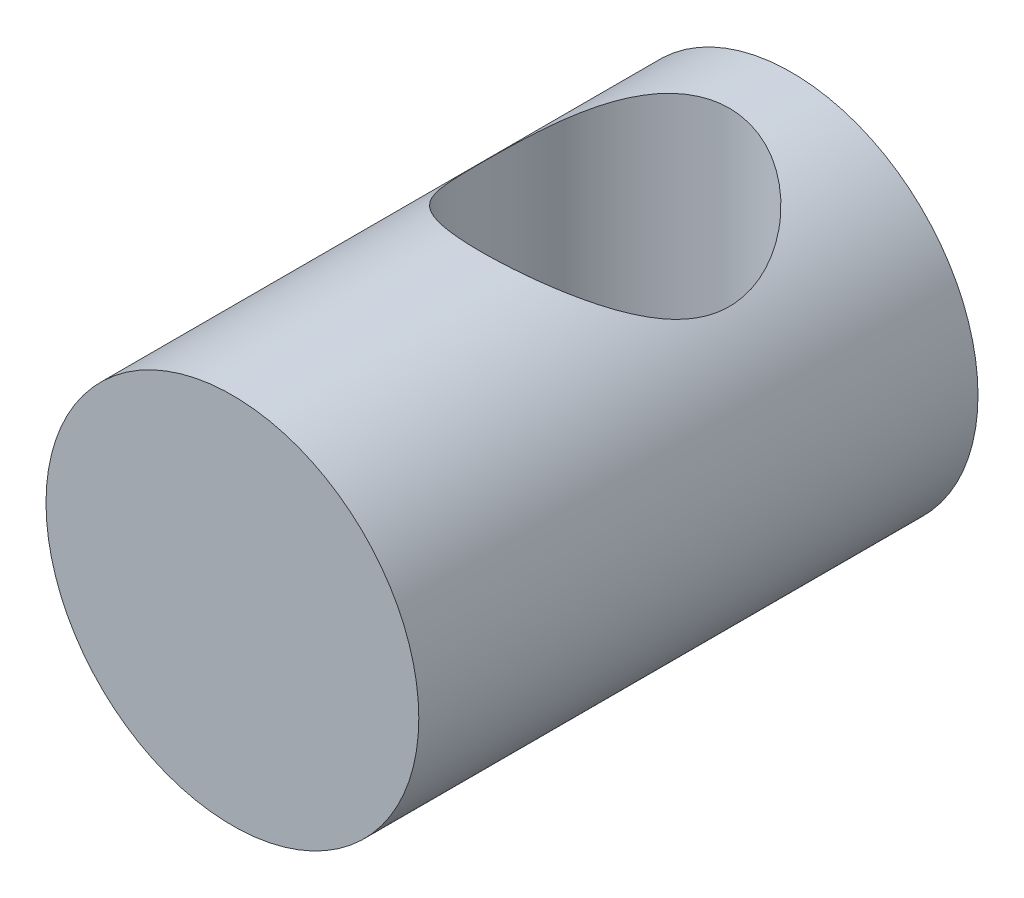
ISO-10303-21;
HEADER;
FILE_DESCRIPTION(('STEP AP214'),'2;1');
FILE_NAME('part.step','',(''),(''),'','','');
FILE_SCHEMA(('AUTOMOTIVE_DESIGN { 1 0 10303 214 1 1 1 1 }'));
ENDSEC;
DATA;
#1=APPLICATION_CONTEXT('core data for automotive mechanical design processes');
#2=APPLICATION_PROTOCOL_DEFINITION('international standard','automotive_design',2000,#1);
#3=PRODUCT_CONTEXT('',#1,'mechanical');
#4=PRODUCT('Part','Part','',(#3));
#5=PRODUCT_RELATED_PRODUCT_CATEGORY('part','',(#4));
#6=PRODUCT_DEFINITION_FORMATION('','',#4);
#7=PRODUCT_DEFINITION_CONTEXT('part definition',#1,'design');
#8=PRODUCT_DEFINITION('design','',#6,#7);
#9=PRODUCT_DEFINITION_SHAPE('','',#8);
#10=(LENGTH_UNIT() NAMED_UNIT(*) SI_UNIT(.MILLI.,.METRE.));
#11=(NAMED_UNIT(*) PLANE_ANGLE_UNIT() SI_UNIT($,.RADIAN.));
#12=(NAMED_UNIT(*) SI_UNIT($,.STERADIAN.) SOLID_ANGLE_UNIT());
#13=UNCERTAINTY_MEASURE_WITH_UNIT(LENGTH_MEASURE(1.E-05),#10,'distance_accuracy_value','');
#14=(GEOMETRIC_REPRESENTATION_CONTEXT(3) GLOBAL_UNCERTAINTY_ASSIGNED_CONTEXT((#13)) GLOBAL_UNIT_ASSIGNED_CONTEXT((#10,
#11,#12)) REPRESENTATION_CONTEXT('',''));
#15=CARTESIAN_POINT('',(0.,0.,0.));
#16=DIRECTION('',(0.,0.,1.));
#17=DIRECTION('',(1.,0.,0.));
#18=AXIS2_PLACEMENT_3D('',#15,#16,#17);
#19=CARTESIAN_POINT('',(0.,0.,-14.2875));
#20=DIRECTION('',(0.,0.,1.));
#21=DIRECTION('',(1.,0.,0.));
#22=AXIS2_PLACEMENT_3D('',#19,#20,#21);
#23=CYLINDRICAL_SURFACE('',#22,4.7625);
#24=CARTESIAN_POINT('',(0.,-4.7625,-12.7));
#25=CARTESIAN_POINT('',(-0.159513506146524,-4.76249829558772,-12.6999978538767));
#26=CARTESIAN_POINT('',(-0.319036822940595,-4.75441585981929,-12.6879120137824));
#27=CARTESIAN_POINT('',(-0.632990333269337,-4.72288699141972,-12.6403157875296));
#28=CARTESIAN_POINT('',(-0.787418072256467,-4.6994332647002,-12.6047942804673));
#29=CARTESIAN_POINT('',(-1.0861866118583,-4.63947623936465,-12.5125037833269));
#30=CARTESIAN_POINT('',(-1.23057094564588,-4.60303407934685,-12.4558342823537));
#31=CARTESIAN_POINT('',(-1.50719688917279,-4.52002748417047,-12.3236619686986));
#32=CARTESIAN_POINT('',(-1.63943673208792,-4.47346157948094,-12.2481564216004));
#33=CARTESIAN_POINT('',(-1.90068942785739,-4.36923384005694,-12.0734820944603));
#34=CARTESIAN_POINT('',(-2.0284762255929,-4.31096574538352,-11.9728490163642));
#35=CARTESIAN_POINT('',(-2.26651828028912,-4.19071922389352,-11.754278552468));
#36=CARTESIAN_POINT('',(-2.37674794067855,-4.12873555797057,-11.6363163752297));
#37=CARTESIAN_POINT('',(-2.59432897361932,-3.99618620055343,-11.3648293648552));
#38=CARTESIAN_POINT('',(-2.69848308269039,-3.92580920318787,-11.2086300251264));
#39=CARTESIAN_POINT('',(-2.87893691841686,-3.79546083955008,-10.8769731383985));
#40=CARTESIAN_POINT('',(-2.95528481583057,-3.73547157335729,-10.7015495876129));
#41=CARTESIAN_POINT('',(-3.0587003056751,-3.65087323287846,-10.3874708216265));
#42=CARTESIAN_POINT('',(-3.09363184983488,-3.62104984276855,-10.2528235810431));
#43=CARTESIAN_POINT('',(-3.14564105737718,-3.57597026836952,-9.97784309874219));
#44=CARTESIAN_POINT('',(-3.16274949511548,-3.56068897885195,-9.83752009390908));
#45=CARTESIAN_POINT('',(-3.17803790572636,-3.54705611398895,-9.55440878855361));
#46=CARTESIAN_POINT('',(-3.17614050629003,-3.54877374048434,-9.41161277524195));
#47=CARTESIAN_POINT('',(-3.1533716036927,-3.56901393593137,-9.12870447959653));
#48=CARTESIAN_POINT('',(-3.13248402562585,-3.58755074204361,-8.9885945736282));
#49=CARTESIAN_POINT('',(-3.07443178311274,-3.63739407712628,-8.7209835560414));
#50=CARTESIAN_POINT('',(-3.03802591942409,-3.66810112544892,-8.59319887882005));
#51=CARTESIAN_POINT('',(-2.95068813219861,-3.73871526235139,-8.34544989020324));
#52=CARTESIAN_POINT('',(-2.89975142875274,-3.77862537744388,-8.22548816814286));
#53=CARTESIAN_POINT('',(-2.77294687249444,-3.87293161809884,-7.97079718501153));
#54=CARTESIAN_POINT('',(-2.69411533030023,-3.92862304429405,-7.83802740802083));
#55=CARTESIAN_POINT('',(-2.51886974692605,-4.04322816135652,-7.58605385994608));
#56=CARTESIAN_POINT('',(-2.42243402035992,-4.10214576296336,-7.46686711829168));
#57=CARTESIAN_POINT('',(-2.19045099950254,-4.23137558230652,-7.21908870886798));
#58=CARTESIAN_POINT('',(-2.05095377025594,-4.30140657245416,-7.09400719771968));
#59=CARTESIAN_POINT('',(-1.74943769853673,-4.43258734804498,-6.8688005649166));
#60=CARTESIAN_POINT('',(-1.58744015020742,-4.493745420159,-6.76865209416239));
#61=CARTESIAN_POINT('',(-1.2777118005163,-4.59018328993748,-6.61435412168688));
#62=CARTESIAN_POINT('',(-1.13340775885306,-4.62818577100373,-6.55503616069962));
#63=CARTESIAN_POINT('',(-0.835082219747427,-4.69118503960837,-6.45778343056955));
#64=CARTESIAN_POINT('',(-0.681069057915084,-4.71619281752454,-6.41983058942756));
#65=CARTESIAN_POINT('',(-0.366689406911034,-4.75100462923954,-6.36720665018473));
#66=CARTESIAN_POINT('',(-0.206298501445474,-4.76074299407139,-6.35263610576051));
#67=CARTESIAN_POINT('',(0.115000912030583,-4.76381945007165,-6.34802024690749));
#68=CARTESIAN_POINT('',(0.275909383071218,-4.75715868774695,-6.35797321797411));
#69=CARTESIAN_POINT('',(0.581748451061771,-4.72915598211033,-6.40020318820457));
#70=CARTESIAN_POINT('',(0.727007443428386,-4.70887816144478,-6.43086296018629));
#71=CARTESIAN_POINT('',(1.00983477297833,-4.65643038239684,-6.51128315154554));
#72=CARTESIAN_POINT('',(1.14740187964354,-4.62425852748368,-6.561046617099));
#73=CARTESIAN_POINT('',(1.42028029136544,-4.54812959640013,-6.68123552155831));
#74=CARTESIAN_POINT('',(1.55495019310494,-4.50357668840463,-6.75272994460303));
#75=CARTESIAN_POINT('',(1.81083430052963,-4.40692945783369,-6.91266284779163));
#76=CARTESIAN_POINT('',(1.93204012275933,-4.35483048266614,-7.00111179235199));
#77=CARTESIAN_POINT('',(2.17781894704302,-4.23790342811906,-7.20821499069174));
#78=CARTESIAN_POINT('',(2.29989360271145,-4.17236523918599,-7.32943393783591));
#79=CARTESIAN_POINT('',(2.52307674305786,-4.04131737275621,-7.59001439509023));
#80=CARTESIAN_POINT('',(2.62417073664107,-3.97580774594569,-7.72938833720815));
#81=CARTESIAN_POINT('',(2.79598082787364,-3.85666740360083,-8.01233858015499));
#82=CARTESIAN_POINT('',(2.86854322403869,-3.80250060257811,-8.15456210271089));
#83=CARTESIAN_POINT('',(2.99237739257787,-3.70584371667973,-8.45164783616389));
#84=CARTESIAN_POINT('',(3.04368748566418,-3.66333266217137,-8.6064866910816));
#85=CARTESIAN_POINT('',(3.11524401668582,-3.60256467927561,-8.89724612217364));
#86=CARTESIAN_POINT('',(3.13941774208685,-3.58132059145467,-9.03156024390672));
#87=CARTESIAN_POINT('',(3.17022488831674,-3.55408653184003,-9.30366008835974));
#88=CARTESIAN_POINT('',(3.17687736084457,-3.54807999179148,-9.44144187574552));
#89=CARTESIAN_POINT('',(3.17220478264998,-3.55225668535638,-9.71652083672794));
#90=CARTESIAN_POINT('',(3.16086908702961,-3.56244950530632,-9.85381767515023));
#91=CARTESIAN_POINT('',(3.12097725174618,-3.59744096141944,-10.1240329106542));
#92=CARTESIAN_POINT('',(3.09239813794198,-3.6222590824651,-10.2569452164285));
#93=CARTESIAN_POINT('',(3.00978981561158,-3.69136350740653,-10.5500662289897));
#94=CARTESIAN_POINT('',(2.9510082914772,-3.7390752101256,-10.7081113219288));
#95=CARTESIAN_POINT('',(2.8112152810101,-3.84527739400296,-11.0100865236058));
#96=CARTESIAN_POINT('',(2.73017258412971,-3.90378297026142,-11.1539964271167));
#97=CARTESIAN_POINT('',(2.54632873237354,-4.02617059026332,-11.4288554963364));
#98=CARTESIAN_POINT('',(2.44315837250286,-4.09013111420676,-11.559521063736));
#99=CARTESIAN_POINT('',(2.21726660759134,-4.21685775015533,-11.8035913840574));
#100=CARTESIAN_POINT('',(2.09453921249742,-4.27962348959933,-11.9169908277243));
#101=CARTESIAN_POINT('',(1.88738506601081,-4.37333498138707,-12.0799185849831));
#102=CARTESIAN_POINT('',(1.80901344364311,-4.40641312548886,-12.1360276198673));
#103=CARTESIAN_POINT('',(1.64665981934885,-4.46961905722943,-12.2413377988571));
#104=CARTESIAN_POINT('',(1.56268042207705,-4.49974819878214,-12.2905421175234));
#105=CARTESIAN_POINT('',(1.38960715113394,-4.55616827072524,-12.3814235622438));
#106=CARTESIAN_POINT('',(1.30051812806184,-4.58246276002165,-12.4231076763622));
#107=CARTESIAN_POINT('',(1.11782960098097,-4.63042056995049,-12.4983567282061));
#108=CARTESIAN_POINT('',(1.02423169482463,-4.65208551661339,-12.5319245171684));
#109=CARTESIAN_POINT('',(0.780235392827383,-4.70058109652366,-12.6065413998412));
#110=CARTESIAN_POINT('',(0.627104096318102,-4.72362103868264,-12.6414276568918));
#111=CARTESIAN_POINT('',(0.315982580686498,-4.75457565287333,-12.6881493609694));
#112=CARTESIAN_POINT('',(0.157996102785212,-4.76250168819873,-12.7000021257078));
#113=CARTESIAN_POINT('',(0.,-4.7625,-12.7));
#114=B_SPLINE_CURVE_WITH_KNOTS('',3,(#24,#25,#26,#27,#28,#29,#30,#31,#32,#33,#34,#35,#36,#37,
#38,#39,#40,#41,#42,#43,#44,#45,#46,#47,#48,#49,#50,#51,#52,#53,#54,#55,#56,#57,#58,#59,#60,#61,
#62,#63,#64,#65,#66,#67,#68,#69,#70,#71,#72,#73,#74,#75,#76,#77,#78,#79,#80,#81,#82,#83,#84,#85,
#86,#87,#88,#89,#90,#91,#92,#93,#94,#95,#96,#97,#98,#99,#100,#101,#102,#103,#104,#105,#106,#107,
#108,#109,#110,#111,#112,#113),.UNSPECIFIED.,.T.,.F.,(4,2,2,2,2,2,2,2,2,2,2,2,2,2,2,2,2,2,2,2,2,
2,2,2,2,2,2,2,2,2,2,2,2,2,2,2,2,2,2,2,2,2,2,2,4),(0.,0.477921997077322,0.956070945278542,
1.43199826818949,1.90799472139476,2.42438283538384,2.94151703421856,3.54023109732372,
4.13790297394634,4.56300988710696,4.98738156455222,5.41348154879912,5.83994255655571,
6.24758818745149,6.6553680680092,7.14609274784494,7.63742604761198,8.23466340273952,
8.8313393398877,9.31106989228961,9.79039404549573,10.2717740223998,10.7531203456965,
11.2006552211841,11.6482614879236,12.1229810060221,12.5979944723587,13.1481222963466,
13.6986288317687,14.2025677230621,14.705593948025,15.1181442623597,15.5302458053914,
15.9425913096208,16.3554874162604,16.8784049132826,17.4020593249786,17.9352455177247,
18.4685953331297,18.7739424593009,19.0791487337135,19.3840699212457,19.6888838348844,
20.1626158186784,20.635991489477),.UNSPECIFIED.);
#115=CARTESIAN_POINT('',(0.,-4.7625,-12.7));
#116=VERTEX_POINT('',#115);
#117=EDGE_CURVE('E50',#116,#116,#114,.T.);
#118=ORIENTED_EDGE('',*,*,#117,.T.);
#119=EDGE_LOOP('',(#118));
#120=FACE_BOUND('',#119,.T.);
#121=CARTESIAN_POINT('',(0.,0.,-14.2875));
#122=DIRECTION('',(0.,0.,1.));
#123=DIRECTION('',(1.,0.,0.));
#124=AXIS2_PLACEMENT_3D('',#121,#122,#123);
#125=CIRCLE('',#124,4.7625);
#126=CARTESIAN_POINT('',(4.7625,0.,-14.2875));
#127=VERTEX_POINT('',#126);
#128=EDGE_CURVE('E10',#127,#127,#125,.T.);
#129=ORIENTED_EDGE('',*,*,#128,.T.);
#130=EDGE_LOOP('',(#129));
#131=FACE_BOUND('',#130,.T.);
#132=CARTESIAN_POINT('',(0.,0.,0.));
#133=DIRECTION('',(0.,0.,1.));
#134=DIRECTION('',(1.,0.,0.));
#135=AXIS2_PLACEMENT_3D('',#132,#133,#134);
#136=CIRCLE('',#135,4.7625);
#137=CARTESIAN_POINT('',(4.7625,0.,0.));
#138=VERTEX_POINT('',#137);
#139=EDGE_CURVE('E44',#138,#138,#136,.T.);
#140=ORIENTED_EDGE('',*,*,#139,.F.);
#141=EDGE_LOOP('',(#140));
#142=FACE_BOUND('',#141,.T.);
#143=CARTESIAN_POINT('',(0.,4.7625,-12.7));
#144=CARTESIAN_POINT('',(0.159513506146528,4.76249829558772,-12.6999978538767));
#145=CARTESIAN_POINT('',(0.319036822940599,4.75441585981929,-12.6879120137824));
#146=CARTESIAN_POINT('',(0.63299033326934,4.72288699141972,-12.6403157875296));
#147=CARTESIAN_POINT('',(0.78741807225647,4.6994332647002,-12.6047942804673));
#148=CARTESIAN_POINT('',(1.08618661185831,4.63947623936465,-12.5125037833269));
#149=CARTESIAN_POINT('',(1.23057094564588,4.60303407934685,-12.4558342823537));
#150=CARTESIAN_POINT('',(1.50719688917279,4.52002748417047,-12.3236619686986));
#151=CARTESIAN_POINT('',(1.63943673208792,4.47346157948094,-12.2481564216004));
#152=CARTESIAN_POINT('',(1.9006894278574,4.36923384005694,-12.0734820944603));
#153=CARTESIAN_POINT('',(2.0284762255929,4.31096574538352,-11.9728490163642));
#154=CARTESIAN_POINT('',(2.26651828028912,4.19071922389352,-11.754278552468));
#155=CARTESIAN_POINT('',(2.37674794067855,4.12873555797056,-11.6363163752297));
#156=CARTESIAN_POINT('',(2.59432897361933,3.99618620055343,-11.3648293648552));
#157=CARTESIAN_POINT('',(2.69848308269039,3.92580920318787,-11.2086300251264));
#158=CARTESIAN_POINT('',(2.87893691841686,3.79546083955007,-10.8769731383985));
#159=CARTESIAN_POINT('',(2.95528481583058,3.73547157335728,-10.7015495876129));
#160=CARTESIAN_POINT('',(3.0587003056751,3.65087323287846,-10.3874708216265));
#161=CARTESIAN_POINT('',(3.09363184983489,3.62104984276855,-10.2528235810431));
#162=CARTESIAN_POINT('',(3.14564105737718,3.57597026836952,-9.97784309874219));
#163=CARTESIAN_POINT('',(3.16274949511548,3.56068897885195,-9.83752009390908));
#164=CARTESIAN_POINT('',(3.17803790572636,3.54705611398895,-9.55440878855361));
#165=CARTESIAN_POINT('',(3.17614050629003,3.54877374048434,-9.41161277524195));
#166=CARTESIAN_POINT('',(3.1533716036927,3.56901393593137,-9.12870447959654));
#167=CARTESIAN_POINT('',(3.13248402562585,3.58755074204361,-8.9885945736282));
#168=CARTESIAN_POINT('',(3.07443178311275,3.63739407712628,-8.72098355604141));
#169=CARTESIAN_POINT('',(3.03802591942409,3.66810112544891,-8.59319887882005));
#170=CARTESIAN_POINT('',(2.95068813219861,3.73871526235138,-8.34544989020324));
#171=CARTESIAN_POINT('',(2.89975142875275,3.77862537744388,-8.22548816814286));
#172=CARTESIAN_POINT('',(2.77294687249445,3.87293161809884,-7.97079718501153));
#173=CARTESIAN_POINT('',(2.69411533030023,3.92862304429405,-7.83802740802084));
#174=CARTESIAN_POINT('',(2.51886974692605,4.04322816135651,-7.58605385994609));
#175=CARTESIAN_POINT('',(2.42243402035992,4.10214576296336,-7.46686711829169));
#176=CARTESIAN_POINT('',(2.19045099950255,4.23137558230652,-7.21908870886799));
#177=CARTESIAN_POINT('',(2.05095377025594,4.30140657245415,-7.09400719771968));
#178=CARTESIAN_POINT('',(1.74943769853674,4.43258734804498,-6.8688005649166));
#179=CARTESIAN_POINT('',(1.58744015020743,4.493745420159,-6.76865209416239));
#180=CARTESIAN_POINT('',(1.27771180051631,4.59018328993748,-6.61435412168689));
#181=CARTESIAN_POINT('',(1.13340775885306,4.62818577100373,-6.55503616069962));
#182=CARTESIAN_POINT('',(0.835082219747434,4.69118503960837,-6.45778343056955));
#183=CARTESIAN_POINT('',(0.68106905791509,4.71619281752454,-6.41983058942756));
#184=CARTESIAN_POINT('',(0.36668940691104,4.75100462923954,-6.36720665018473));
#185=CARTESIAN_POINT('',(0.206298501445481,4.76074299407139,-6.35263610576051));
#186=CARTESIAN_POINT('',(-0.115000912030577,4.76381945007165,-6.3480202469075));
#187=CARTESIAN_POINT('',(-0.275909383071212,4.75715868774695,-6.35797321797411));
#188=CARTESIAN_POINT('',(-0.581748451061767,4.72915598211033,-6.40020318820457));
#189=CARTESIAN_POINT('',(-0.727007443428381,4.70887816144478,-6.43086296018629));
#190=CARTESIAN_POINT('',(-1.00983477297832,4.65643038239684,-6.51128315154554));
#191=CARTESIAN_POINT('',(-1.14740187964354,4.62425852748368,-6.561046617099));
#192=CARTESIAN_POINT('',(-1.42028029136543,4.54812959640013,-6.68123552155831));
#193=CARTESIAN_POINT('',(-1.55495019310494,4.50357668840464,-6.75272994460303));
#194=CARTESIAN_POINT('',(-1.81083430052962,4.40692945783369,-6.91266284779163));
#195=CARTESIAN_POINT('',(-1.93204012275932,4.35483048266614,-7.00111179235199));
#196=CARTESIAN_POINT('',(-2.17781894704302,4.23790342811906,-7.20821499069173));
#197=CARTESIAN_POINT('',(-2.29989360271144,4.172365239186,-7.32943393783591));
#198=CARTESIAN_POINT('',(-2.52307674305786,4.04131737275621,-7.59001439509023));
#199=CARTESIAN_POINT('',(-2.62417073664106,3.9758077459457,-7.72938833720815));
#200=CARTESIAN_POINT('',(-2.79598082787363,3.85666740360083,-8.01233858015499));
#201=CARTESIAN_POINT('',(-2.86854322403869,3.80250060257811,-8.15456210271089));
#202=CARTESIAN_POINT('',(-2.99237739257786,3.70584371667973,-8.45164783616389));
#203=CARTESIAN_POINT('',(-3.04368748566418,3.66333266217138,-8.6064866910816));
#204=CARTESIAN_POINT('',(-3.11524401668582,3.60256467927562,-8.89724612217364));
#205=CARTESIAN_POINT('',(-3.13941774208684,3.58132059145467,-9.03156024390672));
#206=CARTESIAN_POINT('',(-3.17022488831674,3.55408653184003,-9.30366008835974));
#207=CARTESIAN_POINT('',(-3.17687736084456,3.54807999179148,-9.44144187574552));
#208=CARTESIAN_POINT('',(-3.17220478264998,3.55225668535638,-9.71652083672794));
#209=CARTESIAN_POINT('',(-3.16086908702961,3.56244950530632,-9.85381767515024));
#210=CARTESIAN_POINT('',(-3.12097725174618,3.59744096141944,-10.1240329106542));
#211=CARTESIAN_POINT('',(-3.09239813794198,3.6222590824651,-10.2569452164285));
#212=CARTESIAN_POINT('',(-3.00978981561158,3.69136350740653,-10.5500662289897));
#213=CARTESIAN_POINT('',(-2.9510082914772,3.7390752101256,-10.7081113219288));
#214=CARTESIAN_POINT('',(-2.81121528101009,3.84527739400297,-11.0100865236058));
#215=CARTESIAN_POINT('',(-2.7301725841297,3.90378297026142,-11.1539964271167));
#216=CARTESIAN_POINT('',(-2.54632873237354,4.02617059026332,-11.4288554963364));
#217=CARTESIAN_POINT('',(-2.44315837250285,4.09013111420677,-11.5595210637361));
#218=CARTESIAN_POINT('',(-2.21726660759133,4.21685775015533,-11.8035913840574));
#219=CARTESIAN_POINT('',(-2.09453921249741,4.27962348959933,-11.9169908277243));
#220=CARTESIAN_POINT('',(-1.88738506601081,4.37333498138708,-12.0799185849831));
#221=CARTESIAN_POINT('',(-1.8090134436431,4.40641312548886,-12.1360276198673));
#222=CARTESIAN_POINT('',(-1.64665981934885,4.46961905722943,-12.2413377988571));
#223=CARTESIAN_POINT('',(-1.56268042207705,4.49974819878214,-12.2905421175234));
#224=CARTESIAN_POINT('',(-1.38960715113394,4.55616827072524,-12.3814235622438));
#225=CARTESIAN_POINT('',(-1.30051812806184,4.58246276002165,-12.4231076763622));
#226=CARTESIAN_POINT('',(-1.11782960098097,4.63042056995049,-12.4983567282061));
#227=CARTESIAN_POINT('',(-1.02423169482463,4.65208551661339,-12.5319245171684));
#228=CARTESIAN_POINT('',(-0.780235392827379,4.70058109652366,-12.6065413998412));
#229=CARTESIAN_POINT('',(-0.627104096318098,4.72362103868264,-12.6414276568918));
#230=CARTESIAN_POINT('',(-0.315982580686494,4.75457565287333,-12.6881493609694));
#231=CARTESIAN_POINT('',(-0.157996102785208,4.76250168819873,-12.7000021257078));
#232=CARTESIAN_POINT('',(0.,4.7625,-12.7));
#233=B_SPLINE_CURVE_WITH_KNOTS('',3,(#143,#144,#145,#146,#147,#148,#149,#150,#151,#152,#153,
#154,#155,#156,#157,#158,#159,#160,#161,#162,#163,#164,#165,#166,#167,#168,#169,#170,#171,#172,
#173,#174,#175,#176,#177,#178,#179,#180,#181,#182,#183,#184,#185,#186,#187,#188,#189,#190,#191,
#192,#193,#194,#195,#196,#197,#198,#199,#200,#201,#202,#203,#204,#205,#206,#207,#208,#209,#210,
#211,#212,#213,#214,#215,#216,#217,#218,#219,#220,#221,#222,#223,#224,#225,#226,#227,#228,#229,
#230,#231,#232),.UNSPECIFIED.,.T.,.F.,(4,2,2,2,2,2,2,2,2,2,2,2,2,2,2,2,2,2,2,2,2,2,2,2,2,2,2,2,
2,2,2,2,2,2,2,2,2,2,2,2,2,2,2,2,4),(0.,0.477921997077322,0.956070945278542,1.43199826818949,
1.90799472139476,2.42438283538384,2.94151703421856,3.54023109732372,4.13790297394634,
4.56300988710696,4.98738156455222,5.41348154879912,5.83994255655571,6.24758818745149,
6.65536806800919,7.14609274784494,7.63742604761197,8.23466340273951,8.8313393398877,
9.31106989228961,9.79039404549573,10.2717740223998,10.7531203456965,11.2006552211841,
11.6482614879236,12.1229810060221,12.5979944723587,13.1481222963466,13.6986288317687,
14.2025677230621,14.705593948025,15.1181442623597,15.5302458053914,15.9425913096208,
16.3554874162604,16.8784049132826,17.4020593249786,17.9352455177248,18.4685953331297,
18.7739424593009,19.0791487337135,19.3840699212457,19.6888838348845,20.1626158186784,
20.635991489477),.UNSPECIFIED.);
#234=CARTESIAN_POINT('',(0.,4.7625,-12.7));
#235=VERTEX_POINT('',#234);
#236=EDGE_CURVE('E36',#235,#235,#233,.T.);
#237=ORIENTED_EDGE('',*,*,#236,.T.);
#238=EDGE_LOOP('',(#237));
#239=FACE_BOUND('',#238,.T.);
#240=ADVANCED_FACE('F32',(#120,#131,#142,#239),#23,.T.);
#241=CARTESIAN_POINT('',(0.,0.,-14.2875));
#242=DIRECTION('',(0.,0.,1.));
#243=DIRECTION('',(1.,0.,0.));
#244=AXIS2_PLACEMENT_3D('',#241,#242,#243);
#245=PLANE('',#244);
#246=ORIENTED_EDGE('',*,*,#128,.F.);
#247=EDGE_LOOP('',(#246));
#248=FACE_BOUND('',#247,.T.);
#249=ADVANCED_FACE('F61',(#248),#245,.F.);
#250=CARTESIAN_POINT('',(0.,0.,0.));
#251=DIRECTION('',(0.,0.,1.));
#252=DIRECTION('',(1.,0.,0.));
#253=AXIS2_PLACEMENT_3D('',#250,#251,#252);
#254=PLANE('',#253);
#255=ORIENTED_EDGE('',*,*,#139,.T.);
#256=EDGE_LOOP('',(#255));
#257=FACE_BOUND('',#256,.T.);
#258=ADVANCED_FACE('F59',(#257),#254,.T.);
#259=CARTESIAN_POINT('',(0.,7.14375,-9.525));
#260=DIRECTION('',(0.,-1.,0.));
#261=DIRECTION('',(0.,0.,-1.));
#262=AXIS2_PLACEMENT_3D('',#259,#260,#261);
#263=CYLINDRICAL_SURFACE('',#262,3.175);
#264=ORIENTED_EDGE('',*,*,#236,.F.);
#265=EDGE_LOOP('',(#264));
#266=FACE_BOUND('',#265,.T.);
#267=ORIENTED_EDGE('',*,*,#117,.F.);
#268=EDGE_LOOP('',(#267));
#269=FACE_BOUND('',#268,.T.);
#270=ADVANCED_FACE('F55',(#266,#269),#263,.F.);
#271=CLOSED_SHELL('',(#240,#249,#258,#270));
#272=MANIFOLD_SOLID_BREP('B2',#271);
#273=ADVANCED_BREP_SHAPE_REPRESENTATION('',(#18,#272),#14);
#274=SHAPE_DEFINITION_REPRESENTATION(#9,#273);
ENDSEC;
END-ISO-10303-21;
